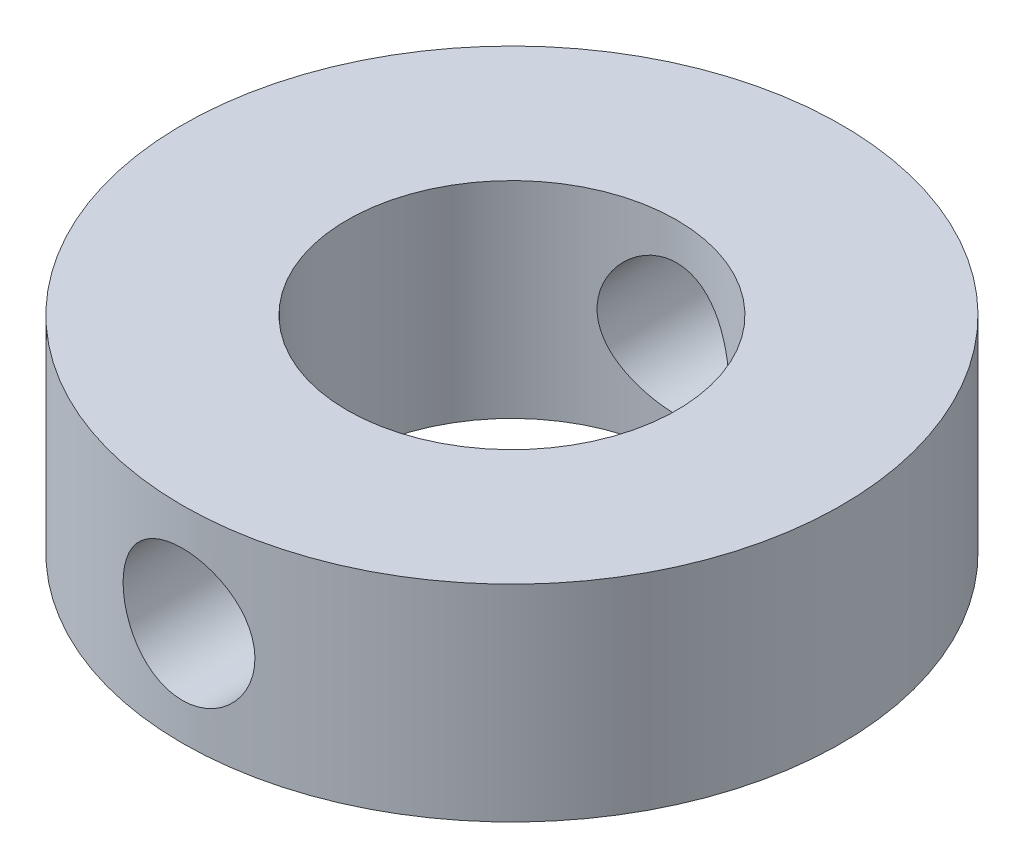
ISO-10303-21;
HEADER;
FILE_DESCRIPTION(('STEP AP214'),'2;1');
FILE_NAME('part.step','',(''),(''),'','','');
FILE_SCHEMA(('AUTOMOTIVE_DESIGN { 1 0 10303 214 1 1 1 1 }'));
ENDSEC;
DATA;
#1=APPLICATION_CONTEXT('core data for automotive mechanical design processes');
#2=APPLICATION_PROTOCOL_DEFINITION('international standard','automotive_design',2000,#1);
#3=PRODUCT_CONTEXT('',#1,'mechanical');
#4=PRODUCT('Part','Part','',(#3));
#5=PRODUCT_RELATED_PRODUCT_CATEGORY('part','',(#4));
#6=PRODUCT_DEFINITION_FORMATION('','',#4);
#7=PRODUCT_DEFINITION_CONTEXT('part definition',#1,'design');
#8=PRODUCT_DEFINITION('design','',#6,#7);
#9=PRODUCT_DEFINITION_SHAPE('','',#8);
#10=(LENGTH_UNIT() NAMED_UNIT(*) SI_UNIT(.MILLI.,.METRE.));
#11=(NAMED_UNIT(*) PLANE_ANGLE_UNIT() SI_UNIT($,.RADIAN.));
#12=(NAMED_UNIT(*) SI_UNIT($,.STERADIAN.) SOLID_ANGLE_UNIT());
#13=UNCERTAINTY_MEASURE_WITH_UNIT(LENGTH_MEASURE(1.E-05),#10,'distance_accuracy_value','');
#14=(GEOMETRIC_REPRESENTATION_CONTEXT(3) GLOBAL_UNCERTAINTY_ASSIGNED_CONTEXT((#13)) GLOBAL_UNIT_ASSIGNED_CONTEXT((#10,
#11,#12)) REPRESENTATION_CONTEXT('',''));
#15=CARTESIAN_POINT('',(0.,0.,0.));
#16=DIRECTION('',(0.,0.,1.));
#17=DIRECTION('',(1.,0.,0.));
#18=AXIS2_PLACEMENT_3D('',#15,#16,#17);
#19=CARTESIAN_POINT('',(0.,2.5,0.));
#20=DIRECTION('',(0.,-1.,0.));
#21=DIRECTION('',(0.,0.,-1.));
#22=AXIS2_PLACEMENT_3D('',#19,#20,#21);
#23=CYLINDRICAL_SURFACE('',#22,8.);
#24=CARTESIAN_POINT('',(0.,2.5,0.));
#25=DIRECTION('',(0.,1.,0.));
#26=DIRECTION('',(0.,0.,1.));
#27=AXIS2_PLACEMENT_3D('',#24,#25,#26);
#28=CIRCLE('',#27,8.);
#29=CARTESIAN_POINT('',(0.,2.5,8.));
#30=VERTEX_POINT('',#29);
#31=EDGE_CURVE('E10',#30,#30,#28,.T.);
#32=ORIENTED_EDGE('',*,*,#31,.F.);
#33=EDGE_LOOP('',(#32));
#34=FACE_BOUND('',#33,.T.);
#35=CARTESIAN_POINT('',(0.,-2.5,0.));
#36=DIRECTION('',(0.,1.,0.));
#37=DIRECTION('',(0.,0.,1.));
#38=AXIS2_PLACEMENT_3D('',#35,#36,#37);
#39=CIRCLE('',#38,8.);
#40=CARTESIAN_POINT('',(0.,-2.5,8.));
#41=VERTEX_POINT('',#40);
#42=EDGE_CURVE('E53',#41,#41,#39,.T.);
#43=ORIENTED_EDGE('',*,*,#42,.T.);
#44=EDGE_LOOP('',(#43));
#45=FACE_BOUND('',#44,.T.);
#46=CARTESIAN_POINT('',(-1.6,0.,7.83836717690617));
#47=CARTESIAN_POINT('',(-1.59999671339984,-0.0889030007848123,7.83836894440906));
#48=CARTESIAN_POINT('',(-1.59256507474887,-0.177847397333066,7.8398961322946));
#49=CARTESIAN_POINT('',(-1.56305965373271,-0.353220008229289,7.84583090088263));
#50=CARTESIAN_POINT('',(-1.54097415531283,-0.439646151417642,7.85024078631784));
#51=CARTESIAN_POINT('',(-1.48287325219155,-0.607419685366663,7.86142197954843));
#52=CARTESIAN_POINT('',(-1.44687170264418,-0.688772034452123,7.86819093793687));
#53=CARTESIAN_POINT('',(-1.36199857227282,-0.844279751515148,7.88332479169087));
#54=CARTESIAN_POINT('',(-1.31312770976184,-0.918435520860649,7.89168959797547));
#55=CARTESIAN_POINT('',(-1.2031665210455,-1.05849760616617,7.90920479510795));
#56=CARTESIAN_POINT('',(-1.14192904946131,-1.12428734061436,7.91836380539592));
#57=CARTESIAN_POINT('',(-1.0092908624341,-1.24473205372637,7.9363595568416));
#58=CARTESIAN_POINT('',(-0.937889435164775,-1.29938625186751,7.94519627537331));
#59=CARTESIAN_POINT('',(-0.786178169478809,-1.39646082820553,7.96164474268099));
#60=CARTESIAN_POINT('',(-0.705796108275537,-1.43877042210662,7.96924514306481));
#61=CARTESIAN_POINT('',(-0.538886640619635,-1.50923989927702,7.98226779013811));
#62=CARTESIAN_POINT('',(-0.452359810272885,-1.53740110704158,7.98769024070591));
#63=CARTESIAN_POINT('',(-0.276826837245591,-1.5784115097914,7.9956851310147));
#64=CARTESIAN_POINT('',(-0.187868382743703,-1.59145756411361,7.99829418061003));
#65=CARTESIAN_POINT('',(-0.00898970950005859,-1.6024815229413,8.00049473893766));
#66=CARTESIAN_POINT('',(0.0809304157309485,-1.60046087943331,8.00008653844414));
#67=CARTESIAN_POINT('',(0.257827201189741,-1.58155811165511,7.99632695789625));
#68=CARTESIAN_POINT('',(0.344827542877552,-1.56488803653144,7.99301757385341));
#69=CARTESIAN_POINT('',(0.514770602528481,-1.51749594806577,7.98387483455053));
#70=CARTESIAN_POINT('',(0.597713157995406,-1.486773372493,7.97804137830463));
#71=CARTESIAN_POINT('',(0.757791141121419,-1.41195193576437,7.96443673631934));
#72=CARTESIAN_POINT('',(0.834886678614239,-1.36776999823218,7.95665357080358));
#73=CARTESIAN_POINT('',(0.980648073375609,-1.26734547642144,7.94000751158057));
#74=CARTESIAN_POINT('',(1.04931295924,-1.21110150436717,7.93114449368356));
#75=CARTESIAN_POINT('',(1.17752228968553,-1.08698620462644,7.91313542983135));
#76=CARTESIAN_POINT('',(1.23688690651781,-1.01892930123266,7.90398714332026));
#77=CARTESIAN_POINT('',(1.34338958908289,-0.873733692078797,7.88658514558017));
#78=CARTESIAN_POINT('',(1.3905274235644,-0.796594814586888,7.87833145127277));
#79=CARTESIAN_POINT('',(1.47130050368301,-0.635166669085112,7.86364875956678));
#80=CARTESIAN_POINT('',(1.50490663644434,-0.550862451776541,7.85722370501679));
#81=CARTESIAN_POINT('',(1.55742454660413,-0.377645882041614,7.84698362114036));
#82=CARTESIAN_POINT('',(1.57633823913063,-0.288734131809466,7.84316825165484));
#83=CARTESIAN_POINT('',(1.59866560965768,-0.110456227201529,7.83864766828524));
#84=CARTESIAN_POINT('',(1.60233897423666,-0.0211238811034555,7.83789035291447));
#85=CARTESIAN_POINT('',(1.59478020529718,0.156877157119493,7.83943177102166));
#86=CARTESIAN_POINT('',(1.58354891699591,0.245545886590181,7.84173033120621));
#87=CARTESIAN_POINT('',(1.54672353291865,0.418829824467576,7.84907571991863));
#88=CARTESIAN_POINT('',(1.52126819334288,0.50347574885722,7.85409598423195));
#89=CARTESIAN_POINT('',(1.45686565649363,0.667301246445986,7.86629582962664));
#90=CARTESIAN_POINT('',(1.41791734779708,0.746480368697152,7.87347558858031));
#91=CARTESIAN_POINT('',(1.32704662754496,0.898260975920258,7.88930249539263));
#92=CARTESIAN_POINT('',(1.27496172477241,0.970763274081322,7.89796754983845));
#93=CARTESIAN_POINT('',(1.15951291554034,1.10609329920146,7.91573958122618));
#94=CARTESIAN_POINT('',(1.09614784823126,1.16892002919881,7.92484660358109));
#95=CARTESIAN_POINT('',(0.958771637596625,1.28410009469692,7.94264553390745));
#96=CARTESIAN_POINT('',(0.884611998287408,1.33627784743999,7.95132892333894));
#97=CARTESIAN_POINT('',(0.728428634615609,1.42743341039933,7.96715404205792));
#98=CARTESIAN_POINT('',(0.646405240693611,1.46641177495165,7.97429583608337));
#99=CARTESIAN_POINT('',(0.477284289318421,1.52980619479461,7.98619670497707));
#100=CARTESIAN_POINT('',(0.390218677564925,1.554304829162,7.99096926628167));
#101=CARTESIAN_POINT('',(0.21310312748786,1.58830599626215,7.99765177500256));
#102=CARTESIAN_POINT('',(0.123053549937943,1.59781033516109,7.99956206719749));
#103=CARTESIAN_POINT('',(-0.0557966302457967,1.60148316954062,8.00029664726593));
#104=CARTESIAN_POINT('',(-0.144591699426403,1.59591564872994,7.99917405678961));
#105=CARTESIAN_POINT('',(-0.319953650105026,1.5701856791235,7.99408069696509));
#106=CARTESIAN_POINT('',(-0.406520559605905,1.55002341384308,7.99010996342963));
#107=CARTESIAN_POINT('',(-0.574804399592153,1.49579361265337,7.97976797384));
#108=CARTESIAN_POINT('',(-0.656531909184448,1.46175779499011,7.97340219596656));
#109=CARTESIAN_POINT('',(-0.813153952297523,1.38078041387056,7.95895555397415));
#110=CARTESIAN_POINT('',(-0.888047945227858,1.33383783055406,7.95087455433417));
#111=CARTESIAN_POINT('',(-1.03018222417017,1.22748898070067,7.93372158652577));
#112=CARTESIAN_POINT('',(-1.0972795457864,1.16789386178116,7.92463573475381));
#113=CARTESIAN_POINT('',(-1.22061218841096,1.03831961584677,7.90657956645842));
#114=CARTESIAN_POINT('',(-1.27684493312435,0.968338032850059,7.89760927780775));
#115=CARTESIAN_POINT('',(-1.37742755112831,0.819073093279675,7.88069348399766));
#116=CARTESIAN_POINT('',(-1.42164290342359,0.739697662143264,7.87276005809463));
#117=CARTESIAN_POINT('',(-1.49603847886053,0.574507562720644,7.85896379495773));
#118=CARTESIAN_POINT('',(-1.52623143356702,0.488698818083901,7.85309908061599));
#119=CARTESIAN_POINT('',(-1.56587062376672,0.335580071301071,7.84527489804438));
#120=CARTESIAN_POINT('',(-1.5786462376364,0.269143328780282,7.84270055859013));
#121=CARTESIAN_POINT('',(-1.59571202873703,0.135145672715571,7.83924605538892));
#122=CARTESIAN_POINT('',(-1.60000249850068,0.0675847980080625,7.83836583323582));
#123=CARTESIAN_POINT('',(-1.6,0.,7.83836717690617));
#124=B_SPLINE_CURVE_WITH_KNOTS('',3,(#46,#47,#48,#49,#50,#51,#52,#53,#54,#55,#56,#57,#58,#59,
#60,#61,#62,#63,#64,#65,#66,#67,#68,#69,#70,#71,#72,#73,#74,#75,#76,#77,#78,#79,#80,#81,#82,#83,
#84,#85,#86,#87,#88,#89,#90,#91,#92,#93,#94,#95,#96,#97,#98,#99,#100,#101,#102,#103,#104,#105,
#106,#107,#108,#109,#110,#111,#112,#113,#114,#115,#116,#117,#118,#119,#120,#121,#122,#123),
.UNSPECIFIED.,.T.,.F.,(4,2,2,2,2,2,2,2,2,2,2,2,2,2,2,2,2,2,2,2,2,2,2,2,2,2,2,2,2,2,2,2,2,2,2,2,
2,2,4),(0.,0.266461542191085,0.533136382854874,0.799546396704937,1.06594154377578,
1.33571604077499,1.60550944056675,1.8776544069992,2.14977389194496,2.41830798212929,
2.68681619385997,2.9515006341366,3.21619566518,3.48255878755685,3.74895257232106,
4.01998954819973,4.29103164996352,4.56265381076443,4.8342405602564,5.1011801248735,
5.36810455245474,5.6324694685331,5.89685616567037,6.16468895639234,6.43254932592334,
6.70452162773521,6.97648250608168,7.2468770172584,7.51723895506605,7.78289627863498,
8.04855026186811,8.31360027320723,8.57867123415495,8.84801843240955,9.1174294222365,
9.38974237726466,9.66180760142292,9.86438085819033,10.0669471309474),.UNSPECIFIED.);
#125=CARTESIAN_POINT('',(-1.6,0.,7.83836717690617));
#126=VERTEX_POINT('',#125);
#127=EDGE_CURVE('E75',#126,#126,#124,.T.);
#128=ORIENTED_EDGE('',*,*,#127,.F.);
#129=EDGE_LOOP('',(#128));
#130=FACE_BOUND('',#129,.T.);
#131=CARTESIAN_POINT('',(0.,1.6,-8.));
#132=CARTESIAN_POINT('',(0.0889230508682132,1.59999672880265,-7.99999836129394));
#133=CARTESIAN_POINT('',(0.177887456322436,1.59256185125177,-7.9985021628517));
#134=CARTESIAN_POINT('',(0.353301612302431,1.56304239981561,-7.9926778499717));
#135=CARTESIAN_POINT('',(0.439749308066169,1.54094618751758,-7.98834748576298));
#136=CARTESIAN_POINT('',(0.607568488421301,1.48281396220674,-7.97733838845259));
#137=CARTESIAN_POINT('',(0.688944748693015,1.4467913010485,-7.97066190522749));
#138=CARTESIAN_POINT('',(0.844492782182761,1.36186840398193,-7.95568636856503));
#139=CARTESIAN_POINT('',(0.918664984121299,1.31296893502847,-7.94738741177131));
#140=CARTESIAN_POINT('',(1.05870956370378,1.20297840913371,-7.92995464527952));
#141=CARTESIAN_POINT('',(1.12447032185364,1.14174663137408,-7.92081192806956));
#142=CARTESIAN_POINT('',(1.24485881057285,1.00913213377328,-7.90278688724142));
#143=CARTESIAN_POINT('',(1.29948567163268,0.93774862186381,-7.89390458400678));
#144=CARTESIAN_POINT('',(1.39653080535619,0.786054091181,-7.87731906900184));
#145=CARTESIAN_POINT('',(1.43883350218539,0.705667769925825,-7.86962731783913));
#146=CARTESIAN_POINT('',(1.50928906652849,0.538749089593473,-7.85642028893468));
#147=CARTESIAN_POINT('',(1.53744333189958,0.452217338645848,-7.85090479619139));
#148=CARTESIAN_POINT('',(1.57844047981572,0.276665017747332,-7.84276488403527));
#149=CARTESIAN_POINT('',(1.59147919673404,0.187691929372438,-7.840103521715));
#150=CARTESIAN_POINT('',(1.60248340436179,0.00878428581705179,-7.83786200097003));
#151=CARTESIAN_POINT('',(1.6004504363416,-0.0811501701122328,-7.83828152748545));
#152=CARTESIAN_POINT('',(1.58152731696291,-0.257994860833605,-7.84212081837095));
#153=CARTESIAN_POINT('',(1.56486166439025,-0.344930249003703,-7.84549524574022));
#154=CARTESIAN_POINT('',(1.51750061539688,-0.514745722660803,-7.85479273856002));
#155=CARTESIAN_POINT('',(1.48680454896109,-0.597625614270413,-7.86071592572446));
#156=CARTESIAN_POINT('',(1.41203965387955,-0.757624418725759,-7.87448989600653));
#157=CARTESIAN_POINT('',(1.36788184197138,-0.834700607310675,-7.88235343701927));
#158=CARTESIAN_POINT('',(1.26750971931629,-0.980433359956502,-7.89911390036899));
#159=CARTESIAN_POINT('',(1.21129402297093,-1.04908895496185,-7.90801094141386));
#160=CARTESIAN_POINT('',(1.08719989529693,-1.1773270439311,-7.92603233986339));
#161=CARTESIAN_POINT('',(1.01912985793991,-1.23672410857461,-7.93515790737448));
#162=CARTESIAN_POINT('',(0.873896038499215,-1.34328615408196,-7.95246157943054));
#163=CARTESIAN_POINT('',(0.796732139807022,-1.39045097806973,-7.96063967182358));
#164=CARTESIAN_POINT('',(0.635295019006273,-1.47124401476156,-7.97514704257419));
#165=CARTESIAN_POINT('',(0.55101091133648,-1.50485102983126,-7.98147342157235));
#166=CARTESIAN_POINT('',(0.377838362317863,-1.55737675846171,-7.99154254380573));
#167=CARTESIAN_POINT('',(0.288950480115919,-1.5762972513178,-7.9952856000085));
#168=CARTESIAN_POINT('',(0.11068704900344,-1.59865032607084,-7.99972274986988));
#169=CARTESIAN_POINT('',(0.0213445253209217,-1.60233667126443,-8.00046679443952));
#170=CARTESIAN_POINT('',(-0.156679894708343,-1.59480022569251,-7.99896083088164));
#171=CARTESIAN_POINT('',(-0.245361827910069,-1.58357827303585,-7.99671099106314));
#172=CARTESIAN_POINT('',(-0.418729055914466,-1.54675460232967,-7.98950131212828));
#173=CARTESIAN_POINT('',(-0.503443117343845,-1.52128309040336,-7.9845660224673));
#174=CARTESIAN_POINT('',(-0.667397803999467,-1.45682562775071,-7.97253683297652));
#175=CARTESIAN_POINT('',(-0.746638018620063,-1.41783866451707,-7.96544277142763));
#176=CARTESIAN_POINT('',(-0.898465877897948,-1.3269080149579,-7.94975858453271));
#177=CARTESIAN_POINT('',(-0.970960202803501,-1.27481155033769,-7.94115120699283));
#178=CARTESIAN_POINT('',(-1.10626883059073,-1.15934529406835,-7.92343575727812));
#179=CARTESIAN_POINT('',(-1.16908209428922,-1.09597429376021,-7.91432763149421));
#180=CARTESIAN_POINT('',(-1.28422494523868,-0.958602636974201,-7.89646885691144));
#181=CARTESIAN_POINT('',(-1.33638032391785,-0.88445480924586,-7.88772576373287));
#182=CARTESIAN_POINT('',(-1.42749667208193,-0.728301821829313,-7.87174706873911));
#183=CARTESIAN_POINT('',(-1.46645816947664,-0.646296976682316,-7.86451140661348));
#184=CARTESIAN_POINT('',(-1.52984294653114,-0.477170806160722,-7.85242784935012));
#185=CARTESIAN_POINT('',(-1.55434159966568,-0.390078654063489,-7.84756759795499));
#186=CARTESIAN_POINT('',(-1.58833384260351,-0.212906474414552,-7.8407589886724));
#187=CARTESIAN_POINT('',(-1.59782938916018,-0.122826838065044,-7.83881025105778));
#188=CARTESIAN_POINT('',(-1.60147345738795,0.0560141832709099,-7.83806639410207));
#189=CARTESIAN_POINT('',(-1.59589726091343,0.144769838283215,-7.83921470702881));
#190=CARTESIAN_POINT('',(-1.5701636865601,0.320050639848042,-7.84440917575382));
#191=CARTESIAN_POINT('',(-1.55000642580688,0.406575804311688,-7.8484553082747));
#192=CARTESIAN_POINT('',(-1.49580570959833,0.574764337984871,-7.85896422750654));
#193=CARTESIAN_POINT('',(-1.46179601074775,0.656438976803864,-7.86542113630129));
#194=CARTESIAN_POINT('',(-1.38088743136257,0.812965953175105,-7.88002743958672));
#195=CARTESIAN_POINT('',(-1.33398747003981,0.887817717960219,-7.8881769759823));
#196=CARTESIAN_POINT('',(-1.22768946365826,1.0299449154405,-7.90542336837161));
#197=CARTESIAN_POINT('',(-1.16809261957629,1.09707002442815,-7.91453396655519));
#198=CARTESIAN_POINT('',(-1.03850299042103,1.22045792884667,-7.93257730995127));
#199=CARTESIAN_POINT('',(-0.968507819445336,1.27671822450764,-7.94151001381095));
#200=CARTESIAN_POINT('',(-0.819228206541195,1.37733543031432,-7.95830131820754));
#201=CARTESIAN_POINT('',(-0.739854215087736,1.42156160524804,-7.96614769950794));
#202=CARTESIAN_POINT('',(-0.574666177505172,1.49597779615455,-7.97976200136));
#203=CARTESIAN_POINT('',(-0.488858017381002,1.52618046325199,-7.98553179421785));
#204=CARTESIAN_POINT('',(-0.335714382278047,1.56584311687155,-7.99322196152593));
#205=CARTESIAN_POINT('',(-0.269250662422055,1.57862910993241,-7.99574885053523));
#206=CARTESIAN_POINT('',(-0.135199240336107,1.59570865977338,-7.99913846623828));
#207=CARTESIAN_POINT('',(-0.0676115739977902,1.60000248721563,-8.00000124597048));
#208=CARTESIAN_POINT('',(0.,1.6,-8.));
#209=B_SPLINE_CURVE_WITH_KNOTS('',3,(#131,#132,#133,#134,#135,#136,#137,#138,#139,#140,#141,
#142,#143,#144,#145,#146,#147,#148,#149,#150,#151,#152,#153,#154,#155,#156,#157,#158,#159,#160,
#161,#162,#163,#164,#165,#166,#167,#168,#169,#170,#171,#172,#173,#174,#175,#176,#177,#178,#179,
#180,#181,#182,#183,#184,#185,#186,#187,#188,#189,#190,#191,#192,#193,#194,#195,#196,#197,#198,
#199,#200,#201,#202,#203,#204,#205,#206,#207,#208),.UNSPECIFIED.,.T.,.F.,(4,2,2,2,2,2,2,2,2,2,2,
2,2,2,2,2,2,2,2,2,2,2,2,2,2,2,2,2,2,2,2,2,2,2,2,2,2,2,4),(0.,0.266521809058014,
0.533255441106117,0.799733976400546,1.06619664356938,1.3358922721795,1.60560895479579,
1.87777912009476,2.14992238984316,2.4184989616574,2.6870480684996,2.95154763210045,
3.21605982805968,3.48235984325748,3.74869047599473,4.01981203986161,4.29093708063712,
4.56248439766438,4.83399881116858,5.10097177082024,5.36792972252588,5.63248726321157,
5.89706462745636,6.16488105653374,6.43272621353488,6.70465005726761,6.97656301957546,
7.24704609652357,7.51749389328663,7.78303556108322,8.04857509588173,8.31347138004976,
8.57838988130986,8.84780921982629,9.11729047252689,9.38959194681019,9.6616472882803,
9.8643004046383,10.0669470619359),.UNSPECIFIED.);
#210=CARTESIAN_POINT('',(0.,1.6,-8.));
#211=VERTEX_POINT('',#210);
#212=EDGE_CURVE('E80',#211,#211,#209,.T.);
#213=ORIENTED_EDGE('',*,*,#212,.F.);
#214=EDGE_LOOP('',(#213));
#215=FACE_BOUND('',#214,.T.);
#216=ADVANCED_FACE('F35',(#34,#45,#130,#215),#23,.T.);
#217=CARTESIAN_POINT('',(0.,2.5,0.));
#218=DIRECTION('',(0.,-1.,0.));
#219=DIRECTION('',(0.,0.,-1.));
#220=AXIS2_PLACEMENT_3D('',#217,#218,#219);
#221=CYLINDRICAL_SURFACE('',#220,4.);
#222=CARTESIAN_POINT('',(-1.6,0.,3.66606055596468));
#223=CARTESIAN_POINT('',(-1.59999060336303,-0.0857115984799129,3.66606921325138));
#224=CARTESIAN_POINT('',(-1.59307185487548,-0.171544427763763,3.66910881987413));
#225=CARTESIAN_POINT('',(-1.56565522447418,-0.340747866301654,3.68088731350276));
#226=CARTESIAN_POINT('',(-1.5451226435537,-0.42411161366439,3.68964076309482));
#227=CARTESIAN_POINT('',(-1.49138802605496,-0.585642353576041,3.71168364633038));
#228=CARTESIAN_POINT('',(-1.45823372202034,-0.663827637888205,3.72495597085692));
#229=CARTESIAN_POINT('',(-1.38033621549729,-0.813508040687693,3.75451732076225));
#230=CARTESIAN_POINT('',(-1.335595543414,-0.885004615320688,3.77080568723139));
#231=CARTESIAN_POINT('',(-1.23305757966994,-1.02340832179316,3.80560692040827));
#232=CARTESIAN_POINT('',(-1.17470348618186,-1.08988513834358,3.82419134366997));
#233=CARTESIAN_POINT('',(-1.04776728461924,-1.2124231978523,3.86089965583049));
#234=CARTESIAN_POINT('',(-0.979181617340544,-1.26848080103189,3.87902338189098));
#235=CARTESIAN_POINT('',(-0.830405048285103,-1.37072511758616,3.91362726325484));
#236=CARTESIAN_POINT('',(-0.749863172489825,-1.41643544117652,3.93001442946855));
#237=CARTESIAN_POINT('',(-0.581460258300096,-1.49347485471185,3.95843142105238));
#238=CARTESIAN_POINT('',(-0.493602215430369,-1.52480979662556,3.97046301907739));
#239=CARTESIAN_POINT('',(-0.317573141471114,-1.57067318914992,3.98830660006628));
#240=CARTESIAN_POINT('',(-0.229623187843684,-1.58594185127122,3.99439149420286));
#241=CARTESIAN_POINT('',(-0.0522130629101211,-1.60162278853015,4.00064248546163));
#242=CARTESIAN_POINT('',(0.0372465326603223,-1.60204060474788,4.00081079015451));
#243=CARTESIAN_POINT('',(0.20978599577225,-1.58841378418001,3.99537570257429));
#244=CARTESIAN_POINT('',(0.292941962299227,-1.57518018180246,3.99009597417469));
#245=CARTESIAN_POINT('',(0.455738487374671,-1.5360056989514,3.97479433175033));
#246=CARTESIAN_POINT('',(0.535378787512127,-1.51006388607969,3.9647720697689));
#247=CARTESIAN_POINT('',(0.690318350809325,-1.44589081369896,3.9407745956616));
#248=CARTESIAN_POINT('',(0.765534098703708,-1.40748022814757,3.9267420837344));
#249=CARTESIAN_POINT('',(0.90864652059246,-1.31962799446479,3.89611668143759));
#250=CARTESIAN_POINT('',(0.976540674172887,-1.2701825655219,3.87952291412059));
#251=CARTESIAN_POINT('',(1.10781506239372,-1.15788069124272,3.84417309742668));
#252=CARTESIAN_POINT('',(1.17060627621891,-1.09435688593293,3.82534661216192));
#253=CARTESIAN_POINT('',(1.28488593230826,-0.957607542543226,3.78849328771823));
#254=CARTESIAN_POINT('',(1.33637067500773,-0.884378841476667,3.77046671181078));
#255=CARTESIAN_POINT('',(1.42792335099435,-0.727664782072838,3.7367751795345));
#256=CARTESIAN_POINT('',(1.46762772138792,-0.643948135612945,3.72119131345105));
#257=CARTESIAN_POINT('',(1.53214100797301,-0.470227607630389,3.69510072373859));
#258=CARTESIAN_POINT('',(1.55695959872352,-0.380227852183322,3.68459070338672));
#259=CARTESIAN_POINT('',(1.58956395906557,-0.202371378051158,3.67063807738052));
#260=CARTESIAN_POINT('',(1.59829767744673,-0.114719642303866,3.66680293158461));
#261=CARTESIAN_POINT('',(1.60124906115921,0.0608617662143597,3.66551598301679));
#262=CARTESIAN_POINT('',(1.59547112847431,0.148791346622274,3.66806224449971));
#263=CARTESIAN_POINT('',(1.57042631583082,0.317167147963905,3.67884835485706));
#264=CARTESIAN_POINT('',(1.55194644961876,0.397754349919605,3.68675566238216));
#265=CARTESIAN_POINT('',(1.50304334952902,0.554630723828808,3.70696040822298));
#266=CARTESIAN_POINT('',(1.47261746744191,0.63091893848585,3.71925881990995));
#267=CARTESIAN_POINT('',(1.39930851158516,0.780481886236392,3.7474702548796));
#268=CARTESIAN_POINT('',(1.35597029461167,0.853508950955566,3.76350963711308));
#269=CARTESIAN_POINT('',(1.2585321795535,0.991586389953333,3.7972030812627));
#270=CARTESIAN_POINT('',(1.20442789878559,1.05663349823648,3.81485779916851));
#271=CARTESIAN_POINT('',(1.08227536934438,1.18189872687937,3.85136732777118));
#272=CARTESIAN_POINT('',(1.01349234355608,1.24140525223282,3.87021445828162));
#273=CARTESIAN_POINT('',(0.866466906695073,1.34814166128827,3.90575835654051));
#274=CARTESIAN_POINT('',(0.788224110774289,1.39537104527779,3.92245503674592));
#275=CARTESIAN_POINT('',(0.624223947201406,1.47603810116898,3.95186972720229));
#276=CARTESIAN_POINT('',(0.53846838479525,1.50947907533263,3.96458868992219));
#277=CARTESIAN_POINT('',(0.361914872735377,1.5612390819261,3.98458170775432));
#278=CARTESIAN_POINT('',(0.271119688235413,1.57956632115205,3.99185871766035));
#279=CARTESIAN_POINT('',(0.0934532082770409,1.59960376130031,3.9998320656841));
#280=CARTESIAN_POINT('',(0.00671239407444277,1.60232010277012,4.00092677395899));
#281=CARTESIAN_POINT('',(-0.165947068586596,1.59371561657272,3.99748833902874));
#282=CARTESIAN_POINT('',(-0.251865839515699,1.5823969137715,3.9929560477353));
#283=CARTESIAN_POINT('',(-0.417736721557131,1.54676256931322,3.97897210691404));
#284=CARTESIAN_POINT('',(-0.497791043718711,1.52285684313955,3.96967584507465));
#285=CARTESIAN_POINT('',(-0.652737883807155,1.46315775635054,3.9471595826563));
#286=CARTESIAN_POINT('',(-0.727629446613823,1.42736220318372,3.9339388584321));
#287=CARTESIAN_POINT('',(-0.873762433484894,1.34311744120852,3.90414475488047));
#288=CARTESIAN_POINT('',(-0.944696309445143,1.29417896409193,3.88744903782584));
#289=CARTESIAN_POINT('',(-1.07764322281926,1.18576918465685,3.85271522549158));
#290=CARTESIAN_POINT('',(-1.13965254859661,1.12629352283191,3.83467657640401));
#291=CARTESIAN_POINT('',(-1.25696101206879,0.994147820379958,3.79790210847538));
#292=CARTESIAN_POINT('',(-1.31160710975922,0.920888901279112,3.77919226084307));
#293=CARTESIAN_POINT('',(-1.40787796035152,0.765646290056982,3.74439737180144));
#294=CARTESIAN_POINT('',(-1.44950118231999,0.683661573672113,3.72831263909965));
#295=CARTESIAN_POINT('',(-1.51519287013865,0.520770238521541,3.70207091566327));
#296=CARTESIAN_POINT('',(-1.54050201133137,0.440427812199058,3.69151134889319));
#297=CARTESIAN_POINT('',(-1.57817420625471,0.276411664295725,3.67556802883171));
#298=CARTESIAN_POINT('',(-1.59057333431041,0.192747907226428,3.67016985657741));
#299=CARTESIAN_POINT('',(-1.59877140664814,0.0724979501296564,3.66659567006108));
#300=CARTESIAN_POINT('',(-1.6000039751959,0.0362598232019177,3.66605689354686));
#301=CARTESIAN_POINT('',(-1.6,0.,3.66606055596468));
#302=B_SPLINE_CURVE_WITH_KNOTS('',3,(#222,#223,#224,#225,#226,#227,#228,#229,#230,#231,#232,
#233,#234,#235,#236,#237,#238,#239,#240,#241,#242,#243,#244,#245,#246,#247,#248,#249,#250,#251,
#252,#253,#254,#255,#256,#257,#258,#259,#260,#261,#262,#263,#264,#265,#266,#267,#268,#269,#270,
#271,#272,#273,#274,#275,#276,#277,#278,#279,#280,#281,#282,#283,#284,#285,#286,#287,#288,#289,
#290,#291,#292,#293,#294,#295,#296,#297,#298,#299,#300,#301),.UNSPECIFIED.,.T.,.F.,(4,2,2,2,2,2,
2,2,2,2,2,2,2,2,2,2,2,2,2,2,2,2,2,2,2,2,2,2,2,2,2,2,2,2,2,2,2,2,2,4),(0.,0.257022119014123,
0.514701868657797,0.771416658634713,1.02807543059089,1.2980449462754,1.56810859478674,
1.84882135273143,2.12941973575584,2.39643346309747,2.66334756244538,2.91526915864242,
3.16720924103248,3.42294640187919,3.67877131952025,3.95139235265085,4.22410245701702,
4.50451566971661,4.78474643835289,5.04785718014745,5.3108881192156,5.55893798463324,
5.80704286916518,6.06520923717369,6.32348091615888,6.60082987392792,6.87819011877406,
7.15548389845458,7.43262700758517,7.6916883179997,7.95071041205289,8.2017759554989,
8.45288782258076,8.71509640907148,8.97741373246573,9.25597002623699,9.53455905402559,
9.78813328650469,10.040997041706,10.1497288441659),.UNSPECIFIED.);
#303=CARTESIAN_POINT('',(-1.6,0.,3.66606055596468));
#304=VERTEX_POINT('',#303);
#305=EDGE_CURVE('E56',#304,#304,#302,.T.);
#306=ORIENTED_EDGE('',*,*,#305,.T.);
#307=EDGE_LOOP('',(#306));
#308=FACE_BOUND('',#307,.T.);
#309=CARTESIAN_POINT('',(0.,2.5,0.));
#310=DIRECTION('',(0.,1.,0.));
#311=DIRECTION('',(0.,0.,1.));
#312=AXIS2_PLACEMENT_3D('',#309,#310,#311);
#313=CIRCLE('',#312,4.);
#314=CARTESIAN_POINT('',(0.,2.5,4.));
#315=VERTEX_POINT('',#314);
#316=EDGE_CURVE('E48',#315,#315,#313,.T.);
#317=ORIENTED_EDGE('',*,*,#316,.T.);
#318=EDGE_LOOP('',(#317));
#319=FACE_BOUND('',#318,.T.);
#320=CARTESIAN_POINT('',(0.,-2.5,0.));
#321=DIRECTION('',(0.,1.,0.));
#322=DIRECTION('',(0.,0.,1.));
#323=AXIS2_PLACEMENT_3D('',#320,#321,#322);
#324=CIRCLE('',#323,4.);
#325=CARTESIAN_POINT('',(0.,-2.5,4.));
#326=VERTEX_POINT('',#325);
#327=EDGE_CURVE('E86',#326,#326,#324,.T.);
#328=ORIENTED_EDGE('',*,*,#327,.F.);
#329=EDGE_LOOP('',(#328));
#330=FACE_BOUND('',#329,.T.);
#331=CARTESIAN_POINT('',(0.,1.6,-4.));
#332=CARTESIAN_POINT('',(0.0859944043543131,1.59999211854102,-3.99999416981668));
#333=CARTESIAN_POINT('',(0.172138051272539,1.5930257983293,-3.99719435445546));
#334=CARTESIAN_POINT('',(0.341997184334317,1.56540183718301,-3.98626762480514));
#335=CARTESIAN_POINT('',(0.425705422048998,1.54470697673109,-3.97812622959102));
#336=CARTESIAN_POINT('',(0.587963138181922,1.49049913755294,-3.95739367370495));
#337=CARTESIAN_POINT('',(0.666528529293567,1.45702812302662,-3.94481709091258));
#338=CARTESIAN_POINT('',(0.816857576262694,1.37838466133876,-3.91645288636863));
#339=CARTESIAN_POINT('',(0.888623581400794,1.33321627606486,-3.90066637966446));
#340=CARTESIAN_POINT('',(1.02680080605631,1.23021160115125,-3.86664708936335));
#341=CARTESIAN_POINT('',(1.09284981804017,1.17191467500779,-3.84833837543353));
#342=CARTESIAN_POINT('',(1.21454000382778,1.04527999721858,-3.81168461524956));
#343=CARTESIAN_POINT('',(1.27017608570683,0.976937362230607,-3.79333955563034));
#344=CARTESIAN_POINT('',(1.3718996538343,0.828457543806187,-3.7577823343771));
#345=CARTESIAN_POINT('',(1.41745198495638,0.747930811181442,-3.74065692771962));
#346=CARTESIAN_POINT('',(1.49420377522972,0.579570881263966,-3.71066917749434));
#347=CARTESIAN_POINT('',(1.52541005142867,0.491741177721311,-3.69780480995341));
#348=CARTESIAN_POINT('',(1.57111905871669,0.315430133126318,-3.67861086128655));
#349=CARTESIAN_POINT('',(1.58631517264452,0.227159011539029,-3.67201136284484));
#350=CARTESIAN_POINT('',(1.60173836931202,0.0490920013541857,-3.66531203239315));
#351=CARTESIAN_POINT('',(1.60197281305058,-0.040703115700012,-3.66520900418215));
#352=CARTESIAN_POINT('',(1.58799149400364,-0.212605337166435,-3.67128400223996));
#353=CARTESIAN_POINT('',(1.57478025144411,-0.294812571527225,-3.6770254003076));
#354=CARTESIAN_POINT('',(1.53595750423826,-0.455727644805371,-3.69340950086269));
#355=CARTESIAN_POINT('',(1.5103438358437,-0.534434870488246,-3.70405305857339));
#356=CARTESIAN_POINT('',(1.44695578604086,-0.688014268956833,-3.72927588070825));
#357=CARTESIAN_POINT('',(1.40894388985225,-0.762775391243752,-3.74393103424631));
#358=CARTESIAN_POINT('',(1.32200516858577,-0.905132653089252,-3.77550493111912));
#359=CARTESIAN_POINT('',(1.27307424408067,-0.972726087522245,-3.79242452365479));
#360=CARTESIAN_POINT('',(1.16124047956355,-1.1043277830416,-3.82821389393817));
#361=CARTESIAN_POINT('',(1.09754997037651,-1.16765498355681,-3.84713331980922));
#362=CARTESIAN_POINT('',(0.960251541944154,-1.28294758240163,-3.88367859966626));
#363=CARTESIAN_POINT('',(0.886641652267546,-1.33491071792823,-3.9013041955626));
#364=CARTESIAN_POINT('',(0.729662122084674,-1.42689395793267,-3.93371745011639));
#365=CARTESIAN_POINT('',(0.646128393077182,-1.46665782495764,-3.94844216076332));
#366=CARTESIAN_POINT('',(0.472819012386305,-1.53133428886244,-3.97291862663007));
#367=CARTESIAN_POINT('',(0.383046557479739,-1.55625443004593,-3.98267290769906));
#368=CARTESIAN_POINT('',(0.205516710086256,-1.58915863633576,-3.99564911605529));
#369=CARTESIAN_POINT('',(0.117954635188427,-1.59805796340285,-3.99922356666812));
#370=CARTESIAN_POINT('',(-0.0574762478462542,-1.60137048042289,-4.00054782808505));
#371=CARTESIAN_POINT('',(-0.145344970579139,-1.59578742523801,-3.99829914865834));
#372=CARTESIAN_POINT('',(-0.314746191297591,-1.57096659795841,-3.98846053651003));
#373=CARTESIAN_POINT('',(-0.39638599342038,-1.55235361571922,-3.98111513076419));
#374=CARTESIAN_POINT('',(-0.555308342448625,-1.50285143335215,-3.962075531244));
#375=CARTESIAN_POINT('',(-0.632590328179876,-1.47196065626506,-3.95038077885225));
#376=CARTESIAN_POINT('',(-0.783263028653362,-1.39777204825604,-3.9233327581665));
#377=CARTESIAN_POINT('',(-0.856462418204325,-1.35412362236548,-3.90787852783843));
#378=CARTESIAN_POINT('',(-0.994754872997244,-1.25604774087548,-3.8749869179642));
#379=CARTESIAN_POINT('',(-1.0598446726089,-1.20161596566191,-3.85754874488217));
#380=CARTESIAN_POINT('',(-1.18457843442306,-1.0793039896403,-3.8211609411049));
#381=CARTESIAN_POINT('',(-1.24357914704485,-1.01077316679503,-3.80218753140042));
#382=CARTESIAN_POINT('',(-1.34940095793097,-0.864447933592505,-3.76593338333706));
#383=CARTESIAN_POINT('',(-1.39622004907001,-0.786651999728041,-3.74865292421209));
#384=CARTESIAN_POINT('',(-1.4766460015453,-0.622830644324716,-3.71771439926167));
#385=CARTESIAN_POINT('',(-1.51012047562756,-0.536732800630151,-3.70409304707831));
#386=CARTESIAN_POINT('',(-1.56183697576424,-0.359413078627875,-3.68258938782345));
#387=CARTESIAN_POINT('',(-1.58009024421545,-0.268195035350059,-3.67470284556799));
#388=CARTESIAN_POINT('',(-1.59977249382272,-0.0902976785803656,-3.66617407439941));
#389=CARTESIAN_POINT('',(-1.60231766584229,-0.00376412832531904,-3.66505136806538));
#390=CARTESIAN_POINT('',(-1.59344252742202,0.168435886170635,-3.66891868826479));
#391=CARTESIAN_POINT('',(-1.58202399033103,0.254102459122067,-3.67390793859835));
#392=CARTESIAN_POINT('',(-1.54645709292292,0.418665751884033,-3.68901319263217));
#393=CARTESIAN_POINT('',(-1.52282999485678,0.497696219546398,-3.6989186546196));
#394=CARTESIAN_POINT('',(-1.46400435879281,0.650702903690785,-3.72259200986158));
#395=CARTESIAN_POINT('',(-1.42880262511505,0.724677717519861,-3.73636096964806));
#396=CARTESIAN_POINT('',(-1.34549821020778,0.870087695416621,-3.76718887683593));
#397=CARTESIAN_POINT('',(-1.29677226812759,0.941134936104387,-3.78439105850594));
#398=CARTESIAN_POINT('',(-1.1887136954172,1.074394653763,-3.8197104349779));
#399=CARTESIAN_POINT('',(-1.1293778678545,1.13660445770265,-3.83782790438726));
#400=CARTESIAN_POINT('',(-0.99720440501797,1.25456228261089,-3.87434853669916));
#401=CARTESIAN_POINT('',(-0.923740800916911,1.30962984551845,-3.89269406369749));
#402=CARTESIAN_POINT('',(-0.767920256228623,1.40666963409731,-3.92640325370974));
#403=CARTESIAN_POINT('',(-0.68555920363779,1.44863576972202,-3.94176552874325));
#404=CARTESIAN_POINT('',(-0.515790449996163,1.51729777215223,-3.96751771852689));
#405=CARTESIAN_POINT('',(-0.428505294575757,1.54426345884827,-3.97799490444023));
#406=CARTESIAN_POINT('',(-0.250301237024977,1.58291129676341,-3.99315444967493));
#407=CARTESIAN_POINT('',(-0.15939482068713,1.59464194939512,-3.9978551959651));
#408=CARTESIAN_POINT('',(-0.0455298383127436,1.59951630478262,-3.9998071960331));
#409=CARTESIAN_POINT('',(-0.0227701509926066,1.60000208690336,-4.00000154375341));
#410=CARTESIAN_POINT('',(0.,1.6,-4.));
#411=B_SPLINE_CURVE_WITH_KNOTS('',3,(#331,#332,#333,#334,#335,#336,#337,#338,#339,#340,#341,
#342,#343,#344,#345,#346,#347,#348,#349,#350,#351,#352,#353,#354,#355,#356,#357,#358,#359,#360,
#361,#362,#363,#364,#365,#366,#367,#368,#369,#370,#371,#372,#373,#374,#375,#376,#377,#378,#379,
#380,#381,#382,#383,#384,#385,#386,#387,#388,#389,#390,#391,#392,#393,#394,#395,#396,#397,#398,
#399,#400,#401,#402,#403,#404,#405,#406,#407,#408,#409,#410),.UNSPECIFIED.,.T.,.F.,(4,2,2,2,2,2,
2,2,2,2,2,2,2,2,2,2,2,2,2,2,2,2,2,2,2,2,2,2,2,2,2,2,2,2,2,2,2,2,2,4),(0.,0.257922390314457,
0.516546908806348,0.774329165977265,1.03202202854387,1.30077905360318,1.56966715947529,
1.85052207055373,2.13124338494614,2.39923284247063,2.6670904507239,2.91630662721098,
3.16556629804838,3.41991301039053,3.67435537550547,3.94846679349246,4.22263274271786,
4.50221530530245,4.78165564891032,5.04455347622406,5.30738314856066,5.55840364451493,
5.80945639195037,6.0681881071861,6.32702367599175,6.60294779699531,6.87891735234998,
7.15756036112662,7.43599738116747,7.69439738714198,7.95276458050436,8.20091454839015,
8.44913308644129,8.71156374445354,8.97407361078715,9.25360338827068,9.53326290912426,
9.80771440810655,10.0812900192347,10.1495843671744),.UNSPECIFIED.);
#412=CARTESIAN_POINT('',(0.,1.6,-4.));
#413=VERTEX_POINT('',#412);
#414=EDGE_CURVE('E39',#413,#413,#411,.T.);
#415=ORIENTED_EDGE('',*,*,#414,.T.);
#416=EDGE_LOOP('',(#415));
#417=FACE_BOUND('',#416,.T.);
#418=ADVANCED_FACE('F61',(#308,#319,#330,#417),#221,.F.);
#419=CARTESIAN_POINT('',(0.,2.5,0.));
#420=DIRECTION('',(0.,1.,0.));
#421=DIRECTION('',(0.,0.,1.));
#422=AXIS2_PLACEMENT_3D('',#419,#420,#421);
#423=PLANE('',#422);
#424=ORIENTED_EDGE('',*,*,#31,.T.);
#425=EDGE_LOOP('',(#424));
#426=FACE_BOUND('',#425,.T.);
#427=ORIENTED_EDGE('',*,*,#316,.F.);
#428=EDGE_LOOP('',(#427));
#429=FACE_BOUND('',#428,.T.);
#430=ADVANCED_FACE('F94',(#426,#429),#423,.T.);
#431=CARTESIAN_POINT('',(0.,-2.5,0.));
#432=DIRECTION('',(0.,1.,0.));
#433=DIRECTION('',(0.,0.,1.));
#434=AXIS2_PLACEMENT_3D('',#431,#432,#433);
#435=PLANE('',#434);
#436=ORIENTED_EDGE('',*,*,#327,.T.);
#437=EDGE_LOOP('',(#436));
#438=FACE_BOUND('',#437,.T.);
#439=ORIENTED_EDGE('',*,*,#42,.F.);
#440=EDGE_LOOP('',(#439));
#441=FACE_BOUND('',#440,.T.);
#442=ADVANCED_FACE('F69',(#438,#441),#435,.F.);
#443=CARTESIAN_POINT('',(0.,0.,50.));
#444=DIRECTION('',(0.,0.,-1.));
#445=DIRECTION('',(-1.,0.,0.));
#446=AXIS2_PLACEMENT_3D('',#443,#444,#445);
#447=CYLINDRICAL_SURFACE('',#446,1.6);
#448=ORIENTED_EDGE('',*,*,#305,.F.);
#449=EDGE_LOOP('',(#448));
#450=FACE_BOUND('',#449,.T.);
#451=ORIENTED_EDGE('',*,*,#127,.T.);
#452=EDGE_LOOP('',(#451));
#453=FACE_BOUND('',#452,.T.);
#454=ADVANCED_FACE('F67',(#450,#453),#447,.F.);
#455=ORIENTED_EDGE('',*,*,#414,.F.);
#456=EDGE_LOOP('',(#455));
#457=FACE_BOUND('',#456,.T.);
#458=ORIENTED_EDGE('',*,*,#212,.T.);
#459=EDGE_LOOP('',(#458));
#460=FACE_BOUND('',#459,.T.);
#461=ADVANCED_FACE('F64',(#457,#460),#447,.F.);
#462=CLOSED_SHELL('',(#216,#418,#430,#442,#454,#461));
#463=MANIFOLD_SOLID_BREP('B2',#462);
#464=ADVANCED_BREP_SHAPE_REPRESENTATION('',(#18,#463),#14);
#465=SHAPE_DEFINITION_REPRESENTATION(#9,#464);
ENDSEC;
END-ISO-10303-21;
